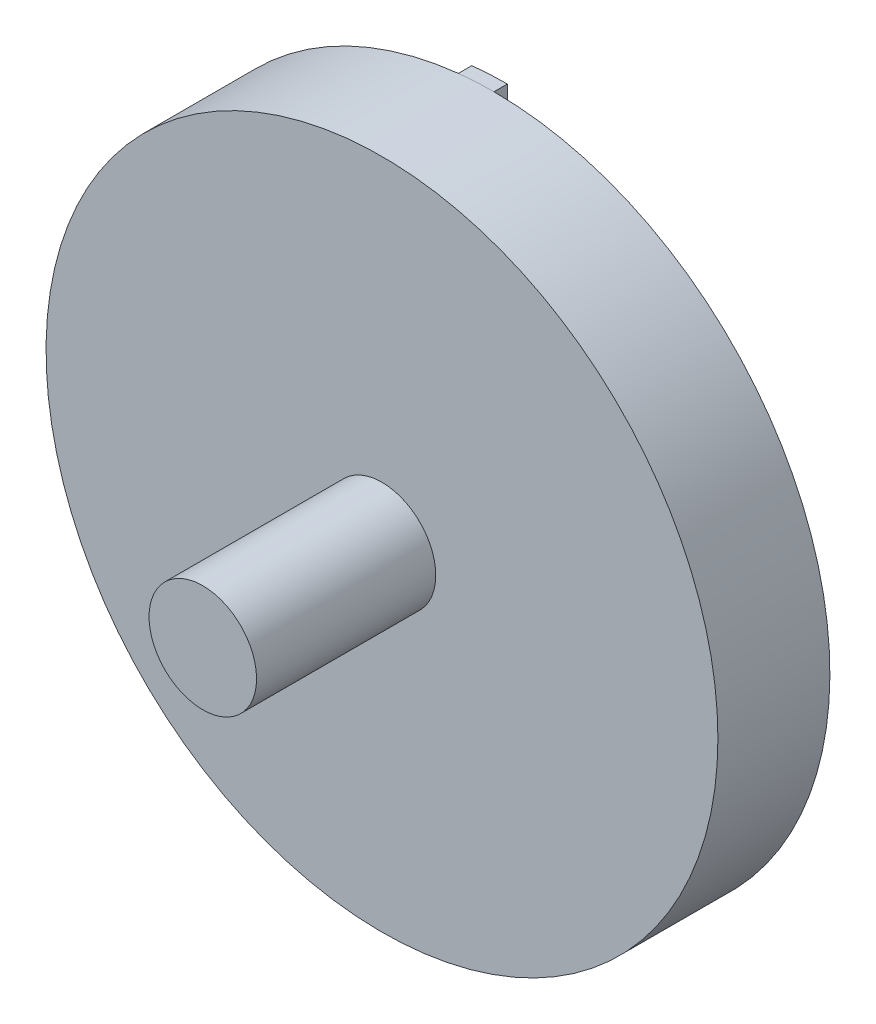
ISO-10303-21;
HEADER;
FILE_DESCRIPTION(('STEP AP214'),'2;1');
FILE_NAME('part.step','',(''),(''),'','','');
FILE_SCHEMA(('AUTOMOTIVE_DESIGN { 1 0 10303 214 1 1 1 1 }'));
ENDSEC;
DATA;
#1=APPLICATION_CONTEXT('core data for automotive mechanical design processes');
#2=APPLICATION_PROTOCOL_DEFINITION('international standard','automotive_design',2000,#1);
#3=PRODUCT_CONTEXT('',#1,'mechanical');
#4=PRODUCT('Part','Part','',(#3));
#5=PRODUCT_RELATED_PRODUCT_CATEGORY('part','',(#4));
#6=PRODUCT_DEFINITION_FORMATION('','',#4);
#7=PRODUCT_DEFINITION_CONTEXT('part definition',#1,'design');
#8=PRODUCT_DEFINITION('design','',#6,#7);
#9=PRODUCT_DEFINITION_SHAPE('','',#8);
#10=(LENGTH_UNIT() NAMED_UNIT(*) SI_UNIT(.MILLI.,.METRE.));
#11=(NAMED_UNIT(*) PLANE_ANGLE_UNIT() SI_UNIT($,.RADIAN.));
#12=(NAMED_UNIT(*) SI_UNIT($,.STERADIAN.) SOLID_ANGLE_UNIT());
#13=UNCERTAINTY_MEASURE_WITH_UNIT(LENGTH_MEASURE(1.E-05),#10,'distance_accuracy_value','');
#14=(GEOMETRIC_REPRESENTATION_CONTEXT(3) GLOBAL_UNCERTAINTY_ASSIGNED_CONTEXT((#13)) GLOBAL_UNIT_ASSIGNED_CONTEXT((#10,
#11,#12)) REPRESENTATION_CONTEXT('',''));
#15=CARTESIAN_POINT('',(0.,0.,0.));
#16=DIRECTION('',(0.,0.,1.));
#17=DIRECTION('',(1.,0.,0.));
#18=AXIS2_PLACEMENT_3D('',#15,#16,#17);
#19=CARTESIAN_POINT('',(0.,0.,0.));
#20=DIRECTION('',(0.,0.,1.));
#21=DIRECTION('',(1.,0.,0.));
#22=AXIS2_PLACEMENT_3D('',#19,#20,#21);
#23=PLANE('',#22);
#24=DIRECTION('',(0.,-1.,0.));
#25=VECTOR('',#24,1.);
#26=CARTESIAN_POINT('',(0.,0.,0.));
#27=LINE('',#26,#25);
#28=CARTESIAN_POINT('',(0.,75.,0.));
#29=VERTEX_POINT('',#28);
#30=CARTESIAN_POINT('',(0.,0.,0.));
#31=VERTEX_POINT('',#30);
#32=EDGE_CURVE('E110',#29,#31,#27,.T.);
#33=ORIENTED_EDGE('',*,*,#32,.F.);
#34=CARTESIAN_POINT('',(0.,0.,0.));
#35=DIRECTION('',(0.,0.,1.));
#36=DIRECTION('',(-0.105986552274975,0.994367563196258,0.));
#37=AXIS2_PLACEMENT_3D('',#34,#35,#36);
#38=CIRCLE('',#37,75.);
#39=CARTESIAN_POINT('',(-7.94903727896524,74.5779973461081,0.));
#40=VERTEX_POINT('',#39);
#41=EDGE_CURVE('E119',#40,#29,#38,.T.);
#42=ORIENTED_EDGE('',*,*,#41,.F.);
#43=DIRECTION('',(0.,1.,0.));
#44=VECTOR('',#43,1.);
#45=CARTESIAN_POINT('',(-7.94903725784363,0.,0.));
#46=LINE('',#45,#44);
#47=CARTESIAN_POINT('',(-7.94903725784363,0.,0.));
#48=VERTEX_POINT('',#47);
#49=EDGE_CURVE('E69',#48,#40,#46,.T.);
#50=ORIENTED_EDGE('',*,*,#49,.F.);
#51=DIRECTION('',(-1.,0.,0.));
#52=VECTOR('',#51,1.);
#53=CARTESIAN_POINT('',(0.,0.,0.));
#54=LINE('',#53,#52);
#55=EDGE_CURVE('E65',#31,#48,#54,.T.);
#56=ORIENTED_EDGE('',*,*,#55,.F.);
#57=EDGE_LOOP('',(#33,#42,#50,#56));
#58=FACE_BOUND('',#57,.T.);
#59=ADVANCED_FACE('F45',(#58),#23,.F.);
#60=CARTESIAN_POINT('',(0.,0.,25.));
#61=DIRECTION('',(0.,0.,-1.));
#62=DIRECTION('',(-1.,0.,0.));
#63=AXIS2_PLACEMENT_3D('',#60,#61,#62);
#64=CYLINDRICAL_SURFACE('',#63,75.);
#65=CARTESIAN_POINT('',(0.,0.,25.));
#66=DIRECTION('',(0.,0.,1.));
#67=DIRECTION('',(1.,0.,0.));
#68=AXIS2_PLACEMENT_3D('',#65,#66,#67);
#69=CIRCLE('',#68,75.);
#70=CARTESIAN_POINT('',(75.,0.,25.));
#71=VERTEX_POINT('',#70);
#72=EDGE_CURVE('E57',#71,#71,#69,.T.);
#73=ORIENTED_EDGE('',*,*,#72,.F.);
#74=EDGE_LOOP('',(#73));
#75=FACE_BOUND('',#74,.T.);
#76=CARTESIAN_POINT('',(-7.94903725784363,74.577562354058,0.));
#77=CARTESIAN_POINT('',(-3.98625422723695,74.9998222372941,0.));
#78=CARTESIAN_POINT('',(0.,75.,0.));
#79=B_SPLINE_CURVE_WITH_KNOTS('',2,(#76,#77,#78),.UNSPECIFIED.,.F.,.F.,(3,3),(0.,1.),.UNSPECIFIED.);
#80=EDGE_CURVE('E131',#29,#40,#79,.F.);
#81=ORIENTED_EDGE('',*,*,#80,.T.);
#82=ORIENTED_EDGE('',*,*,#41,.T.);
#83=EDGE_LOOP('',(#81,#82));
#84=FACE_BOUND('',#83,.T.);
#85=ADVANCED_FACE('F47',(#75,#84),#64,.T.);
#86=CARTESIAN_POINT('',(0.,0.,25.));
#87=DIRECTION('',(0.,0.,1.));
#88=DIRECTION('',(1.,0.,0.));
#89=AXIS2_PLACEMENT_3D('',#86,#87,#88);
#90=PLANE('',#89);
#91=CARTESIAN_POINT('',(0.,0.,25.));
#92=DIRECTION('',(0.,0.,1.));
#93=DIRECTION('',(1.,0.,0.));
#94=AXIS2_PLACEMENT_3D('',#91,#92,#93);
#95=CIRCLE('',#94,12.);
#96=CARTESIAN_POINT('',(12.,0.,25.));
#97=VERTEX_POINT('',#96);
#98=EDGE_CURVE('E11',#97,#97,#95,.T.);
#99=ORIENTED_EDGE('',*,*,#98,.F.);
#100=EDGE_LOOP('',(#99));
#101=FACE_BOUND('',#100,.T.);
#102=ORIENTED_EDGE('',*,*,#72,.T.);
#103=EDGE_LOOP('',(#102));
#104=FACE_BOUND('',#103,.T.);
#105=ADVANCED_FACE('F195',(#101,#104),#90,.T.);
#106=CARTESIAN_POINT('',(0.,0.,65.));
#107=DIRECTION('',(0.,0.,-1.));
#108=DIRECTION('',(-1.,0.,0.));
#109=AXIS2_PLACEMENT_3D('',#106,#107,#108);
#110=CYLINDRICAL_SURFACE('',#109,12.);
#111=CARTESIAN_POINT('',(0.,0.,65.));
#112=DIRECTION('',(0.,0.,1.));
#113=DIRECTION('',(1.,0.,0.));
#114=AXIS2_PLACEMENT_3D('',#111,#112,#113);
#115=CIRCLE('',#114,12.);
#116=CARTESIAN_POINT('',(12.,0.,65.));
#117=VERTEX_POINT('',#116);
#118=EDGE_CURVE('E114',#117,#117,#115,.T.);
#119=ORIENTED_EDGE('',*,*,#118,.F.);
#120=EDGE_LOOP('',(#119));
#121=FACE_BOUND('',#120,.T.);
#122=ORIENTED_EDGE('',*,*,#98,.T.);
#123=EDGE_LOOP('',(#122));
#124=FACE_BOUND('',#123,.T.);
#125=ADVANCED_FACE('F201',(#121,#124),#110,.T.);
#126=CARTESIAN_POINT('',(0.,0.,65.));
#127=DIRECTION('',(0.,0.,1.));
#128=DIRECTION('',(1.,0.,0.));
#129=AXIS2_PLACEMENT_3D('',#126,#127,#128);
#130=PLANE('',#129);
#131=ORIENTED_EDGE('',*,*,#118,.T.);
#132=EDGE_LOOP('',(#131));
#133=FACE_BOUND('',#132,.T.);
#134=ADVANCED_FACE('F205',(#133),#130,.T.);
#135=CARTESIAN_POINT('',(0.,0.,-3.00000000000001));
#136=DIRECTION('',(0.,1.,0.));
#137=DIRECTION('',(0.,0.,1.));
#138=AXIS2_PLACEMENT_3D('',#135,#136,#137);
#139=PLANE('',#138);
#140=ORIENTED_EDGE('',*,*,#55,.T.);
#141=DIRECTION('',(0.,0.,1.));
#142=VECTOR('',#141,1.);
#143=CARTESIAN_POINT('',(-7.94903725784363,0.,-3.00000000000001));
#144=LINE('',#143,#142);
#145=CARTESIAN_POINT('',(-7.94903725784363,0.,-3.00000000000001));
#146=VERTEX_POINT('',#145);
#147=EDGE_CURVE('E93',#146,#48,#144,.T.);
#148=ORIENTED_EDGE('',*,*,#147,.F.);
#149=DIRECTION('',(-1.,0.,0.));
#150=VECTOR('',#149,1.);
#151=CARTESIAN_POINT('',(0.,0.,-3.00000000000001));
#152=LINE('',#151,#150);
#153=CARTESIAN_POINT('',(0.,0.,-3.00000000000001));
#154=VERTEX_POINT('',#153);
#155=EDGE_CURVE('E100',#154,#146,#152,.T.);
#156=ORIENTED_EDGE('',*,*,#155,.F.);
#157=DIRECTION('',(0.,0.,1.));
#158=VECTOR('',#157,1.);
#159=CARTESIAN_POINT('',(0.,0.,-3.00000000000001));
#160=LINE('',#159,#158);
#161=EDGE_CURVE('E125',#154,#31,#160,.T.);
#162=ORIENTED_EDGE('',*,*,#161,.T.);
#163=EDGE_LOOP('',(#140,#148,#156,#162));
#164=FACE_BOUND('',#163,.T.);
#165=ADVANCED_FACE('F112',(#164),#139,.F.);
#166=CARTESIAN_POINT('',(-7.94903725784363,0.,-3.00000000000001));
#167=DIRECTION('',(1.,0.,0.));
#168=DIRECTION('',(0.,0.,-1.));
#169=AXIS2_PLACEMENT_3D('',#166,#167,#168);
#170=PLANE('',#169);
#171=ORIENTED_EDGE('',*,*,#49,.T.);
#172=DIRECTION('',(0.,0.,1.));
#173=VECTOR('',#172,1.);
#174=CARTESIAN_POINT('',(-7.94903725784363,74.577562354058,-3.00000000000001));
#175=LINE('',#174,#173);
#176=CARTESIAN_POINT('',(-7.94903725784363,74.577562354058,-3.00000000000001));
#177=VERTEX_POINT('',#176);
#178=EDGE_CURVE('E95',#177,#40,#175,.T.);
#179=ORIENTED_EDGE('',*,*,#178,.F.);
#180=DIRECTION('',(0.,1.,0.));
#181=VECTOR('',#180,1.);
#182=CARTESIAN_POINT('',(-7.94903725784363,0.,-3.00000000000001));
#183=LINE('',#182,#181);
#184=EDGE_CURVE('E89',#146,#177,#183,.T.);
#185=ORIENTED_EDGE('',*,*,#184,.F.);
#186=ORIENTED_EDGE('',*,*,#147,.T.);
#187=EDGE_LOOP('',(#171,#179,#185,#186));
#188=FACE_BOUND('',#187,.T.);
#189=ADVANCED_FACE('F91',(#188),#170,.F.);
#190=CARTESIAN_POINT('',(-7.94903725784363,74.577562354058,-3.00000000000001));
#191=CARTESIAN_POINT('',(-3.98625422723695,74.9998222372941,-3.00000000000001));
#192=CARTESIAN_POINT('',(0.,75.,-3.00000000000001));
#193=B_SPLINE_CURVE_WITH_KNOTS('',2,(#190,#191,#192),.UNSPECIFIED.,.F.,.F.,(3,3),(0.,1.),.UNSPECIFIED.);
#194=DIRECTION('',(0.,0.,1.));
#195=VECTOR('',#194,1.);
#196=SURFACE_OF_LINEAR_EXTRUSION('',#193,#195);
#197=ORIENTED_EDGE('',*,*,#80,.F.);
#198=DIRECTION('',(0.,0.,1.));
#199=VECTOR('',#198,1.);
#200=CARTESIAN_POINT('',(0.,75.,-3.00000000000001));
#201=LINE('',#200,#199);
#202=CARTESIAN_POINT('',(0.,75.,-3.00000000000001));
#203=VERTEX_POINT('',#202);
#204=EDGE_CURVE('E121',#203,#29,#201,.T.);
#205=ORIENTED_EDGE('',*,*,#204,.F.);
#206=EDGE_CURVE('E99',#177,#203,#193,.T.);
#207=ORIENTED_EDGE('',*,*,#206,.F.);
#208=ORIENTED_EDGE('',*,*,#178,.T.);
#209=EDGE_LOOP('',(#197,#205,#207,#208));
#210=FACE_BOUND('',#209,.T.);
#211=ADVANCED_FACE('F138',(#210),#196,.F.);
#212=CARTESIAN_POINT('',(0.,0.,-3.00000000000001));
#213=DIRECTION('',(-1.,0.,0.));
#214=DIRECTION('',(0.,0.,1.));
#215=AXIS2_PLACEMENT_3D('',#212,#213,#214);
#216=PLANE('',#215);
#217=ORIENTED_EDGE('',*,*,#32,.T.);
#218=ORIENTED_EDGE('',*,*,#161,.F.);
#219=DIRECTION('',(0.,-1.,0.));
#220=VECTOR('',#219,1.);
#221=CARTESIAN_POINT('',(0.,0.,-3.00000000000001));
#222=LINE('',#221,#220);
#223=EDGE_CURVE('E105',#203,#154,#222,.T.);
#224=ORIENTED_EDGE('',*,*,#223,.F.);
#225=ORIENTED_EDGE('',*,*,#204,.T.);
#226=EDGE_LOOP('',(#217,#218,#224,#225));
#227=FACE_BOUND('',#226,.T.);
#228=ADVANCED_FACE('F149',(#227),#216,.F.);
#229=CARTESIAN_POINT('',(-3.98038642807938,74.8943017071616,-3.00000000000001));
#230=DIRECTION('',(0.,0.,1.));
#231=DIRECTION('',(1.,0.,0.));
#232=AXIS2_PLACEMENT_3D('',#229,#230,#231);
#233=PLANE('',#232);
#234=ORIENTED_EDGE('',*,*,#155,.T.);
#235=ORIENTED_EDGE('',*,*,#184,.T.);
#236=ORIENTED_EDGE('',*,*,#206,.T.);
#237=ORIENTED_EDGE('',*,*,#223,.T.);
#238=EDGE_LOOP('',(#234,#235,#236,#237));
#239=FACE_BOUND('',#238,.T.);
#240=ADVANCED_FACE('F103',(#239),#233,.F.);
#241=CLOSED_SHELL('',(#59,#85,#105,#125,#134,#165,#189,#211,#228,#240));
#242=MANIFOLD_SOLID_BREP('B2',#241);
#243=ADVANCED_BREP_SHAPE_REPRESENTATION('',(#18,#242),#14);
#244=SHAPE_DEFINITION_REPRESENTATION(#9,#243);
ENDSEC;
END-ISO-10303-21;
